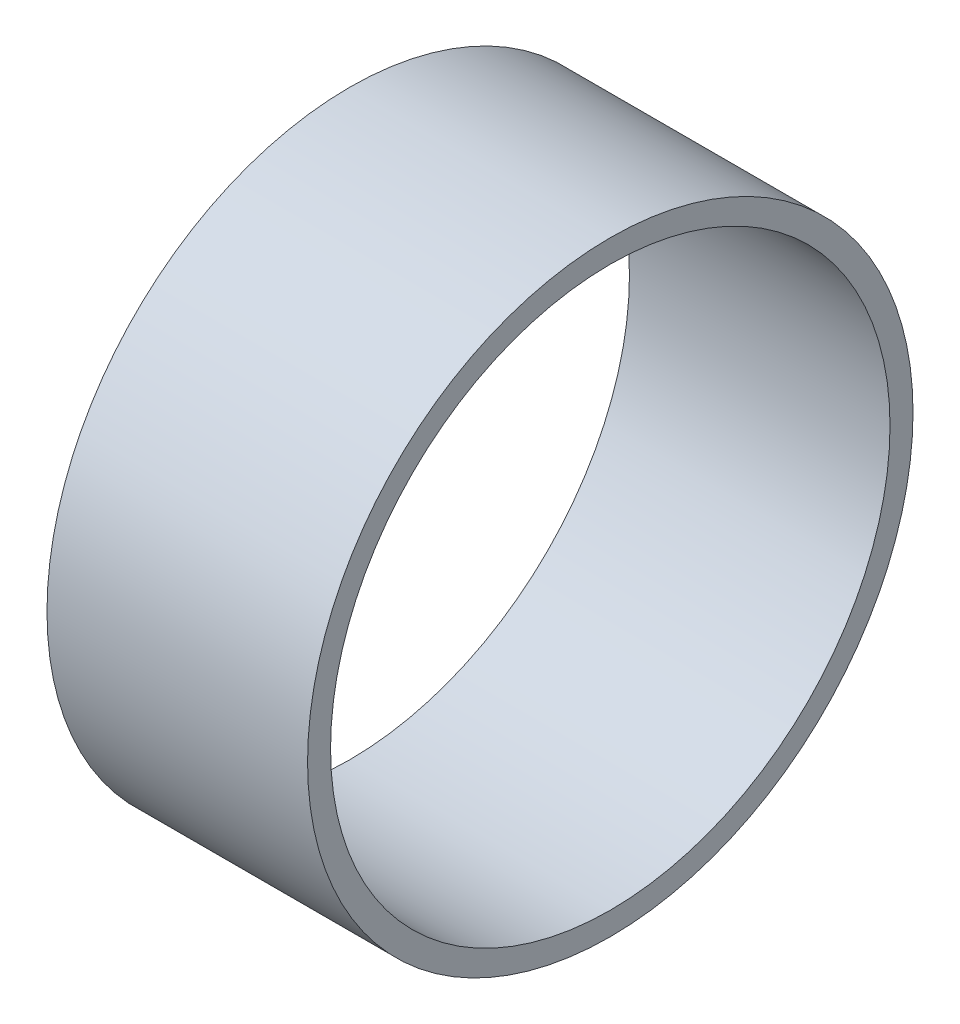
ISO-10303-21;
HEADER;
FILE_DESCRIPTION(('STEP AP214'),'2;1');
FILE_NAME('part.step','',(''),(''),'','','');
FILE_SCHEMA(('AUTOMOTIVE_DESIGN { 1 0 10303 214 1 1 1 1 }'));
ENDSEC;
DATA;
#1=APPLICATION_CONTEXT('core data for automotive mechanical design processes');
#2=APPLICATION_PROTOCOL_DEFINITION('international standard','automotive_design',2000,#1);
#3=PRODUCT_CONTEXT('',#1,'mechanical');
#4=PRODUCT('Part','Part','',(#3));
#5=PRODUCT_RELATED_PRODUCT_CATEGORY('part','',(#4));
#6=PRODUCT_DEFINITION_FORMATION('','',#4);
#7=PRODUCT_DEFINITION_CONTEXT('part definition',#1,'design');
#8=PRODUCT_DEFINITION('design','',#6,#7);
#9=PRODUCT_DEFINITION_SHAPE('','',#8);
#10=(LENGTH_UNIT() NAMED_UNIT(*) SI_UNIT(.MILLI.,.METRE.));
#11=(NAMED_UNIT(*) PLANE_ANGLE_UNIT() SI_UNIT($,.RADIAN.));
#12=(NAMED_UNIT(*) SI_UNIT($,.STERADIAN.) SOLID_ANGLE_UNIT());
#13=UNCERTAINTY_MEASURE_WITH_UNIT(LENGTH_MEASURE(1.E-05),#10,'distance_accuracy_value','');
#14=(GEOMETRIC_REPRESENTATION_CONTEXT(3) GLOBAL_UNCERTAINTY_ASSIGNED_CONTEXT((#13)) GLOBAL_UNIT_ASSIGNED_CONTEXT((#10,
#11,#12)) REPRESENTATION_CONTEXT('',''));
#15=CARTESIAN_POINT('',(0.,0.,0.));
#16=DIRECTION('',(0.,0.,1.));
#17=DIRECTION('',(1.,0.,0.));
#18=AXIS2_PLACEMENT_3D('',#15,#16,#17);
#19=CARTESIAN_POINT('',(17.,0.,0.));
#20=DIRECTION('',(1.,0.,0.));
#21=DIRECTION('',(0.,0.,-1.));
#22=AXIS2_PLACEMENT_3D('',#19,#20,#21);
#23=PLANE('',#22);
#24=CARTESIAN_POINT('',(17.,0.,0.));
#25=DIRECTION('',(1.,0.,0.));
#26=DIRECTION('',(0.,0.,-1.));
#27=AXIS2_PLACEMENT_3D('',#24,#25,#26);
#28=CIRCLE('',#27,19.75);
#29=CARTESIAN_POINT('',(17.,0.,-19.75));
#30=VERTEX_POINT('',#29);
#31=EDGE_CURVE('E10',#30,#30,#28,.T.);
#32=ORIENTED_EDGE('',*,*,#31,.T.);
#33=EDGE_LOOP('',(#32));
#34=FACE_BOUND('',#33,.T.);
#35=CARTESIAN_POINT('',(17.,0.,0.));
#36=DIRECTION('',(1.,0.,0.));
#37=DIRECTION('',(0.,0.,-1.));
#38=AXIS2_PLACEMENT_3D('',#35,#36,#37);
#39=CIRCLE('',#38,18.25);
#40=CARTESIAN_POINT('',(17.,0.,-18.25));
#41=VERTEX_POINT('',#40);
#42=EDGE_CURVE('E42',#41,#41,#39,.T.);
#43=ORIENTED_EDGE('',*,*,#42,.F.);
#44=EDGE_LOOP('',(#43));
#45=FACE_BOUND('',#44,.T.);
#46=ADVANCED_FACE('F31',(#34,#45),#23,.T.);
#47=CARTESIAN_POINT('',(0.,0.,0.));
#48=DIRECTION('',(1.,0.,0.));
#49=DIRECTION('',(0.,0.,-1.));
#50=AXIS2_PLACEMENT_3D('',#47,#48,#49);
#51=PLANE('',#50);
#52=CARTESIAN_POINT('',(0.,0.,0.));
#53=DIRECTION('',(1.,0.,0.));
#54=DIRECTION('',(0.,0.,-1.));
#55=AXIS2_PLACEMENT_3D('',#52,#53,#54);
#56=CIRCLE('',#55,19.75);
#57=CARTESIAN_POINT('',(0.,0.,-19.75));
#58=VERTEX_POINT('',#57);
#59=EDGE_CURVE('E35',#58,#58,#56,.T.);
#60=ORIENTED_EDGE('',*,*,#59,.F.);
#61=EDGE_LOOP('',(#60));
#62=FACE_BOUND('',#61,.T.);
#63=CARTESIAN_POINT('',(0.,0.,0.));
#64=DIRECTION('',(1.,0.,0.));
#65=DIRECTION('',(0.,0.,-1.));
#66=AXIS2_PLACEMENT_3D('',#63,#64,#65);
#67=CIRCLE('',#66,18.25);
#68=CARTESIAN_POINT('',(0.,0.,-18.25));
#69=VERTEX_POINT('',#68);
#70=EDGE_CURVE('E44',#69,#69,#67,.T.);
#71=ORIENTED_EDGE('',*,*,#70,.T.);
#72=EDGE_LOOP('',(#71));
#73=FACE_BOUND('',#72,.T.);
#74=ADVANCED_FACE('F54',(#62,#73),#51,.F.);
#75=CARTESIAN_POINT('',(17.,0.,0.));
#76=DIRECTION('',(-1.,0.,0.));
#77=DIRECTION('',(0.,0.,1.));
#78=AXIS2_PLACEMENT_3D('',#75,#76,#77);
#79=CYLINDRICAL_SURFACE('',#78,19.75);
#80=ORIENTED_EDGE('',*,*,#31,.F.);
#81=EDGE_LOOP('',(#80));
#82=FACE_BOUND('',#81,.T.);
#83=ORIENTED_EDGE('',*,*,#59,.T.);
#84=EDGE_LOOP('',(#83));
#85=FACE_BOUND('',#84,.T.);
#86=ADVANCED_FACE('F33',(#82,#85),#79,.T.);
#87=CARTESIAN_POINT('',(17.,0.,0.));
#88=DIRECTION('',(-1.,0.,0.));
#89=DIRECTION('',(0.,0.,1.));
#90=AXIS2_PLACEMENT_3D('',#87,#88,#89);
#91=CYLINDRICAL_SURFACE('',#90,18.25);
#92=ORIENTED_EDGE('',*,*,#42,.T.);
#93=EDGE_LOOP('',(#92));
#94=FACE_BOUND('',#93,.T.);
#95=ORIENTED_EDGE('',*,*,#70,.F.);
#96=EDGE_LOOP('',(#95));
#97=FACE_BOUND('',#96,.T.);
#98=ADVANCED_FACE('F50',(#94,#97),#91,.F.);
#99=CLOSED_SHELL('',(#46,#74,#86,#98));
#100=MANIFOLD_SOLID_BREP('B2',#99);
#101=ADVANCED_BREP_SHAPE_REPRESENTATION('',(#18,#100),#14);
#102=SHAPE_DEFINITION_REPRESENTATION(#9,#101);
ENDSEC;
END-ISO-10303-21;
